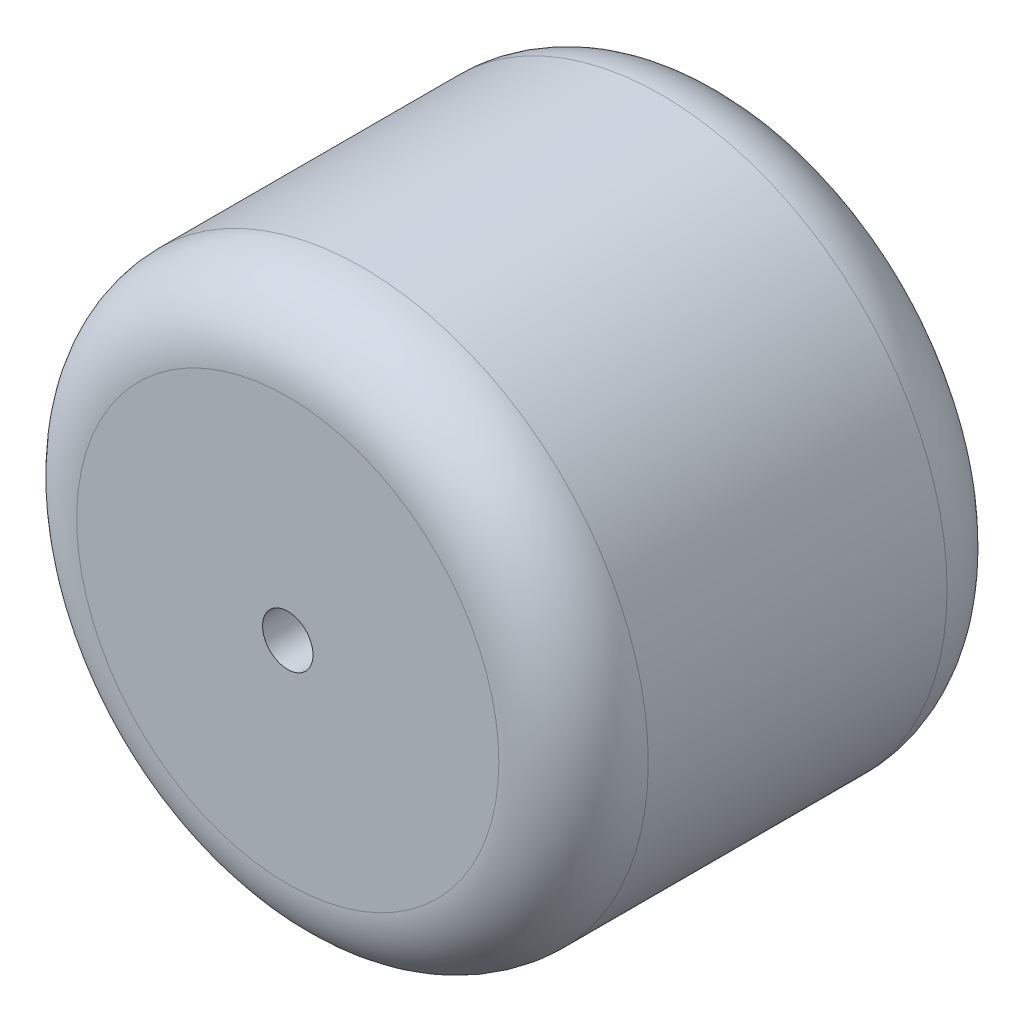
ISO-10303-21;
HEADER;
FILE_DESCRIPTION(('STEP AP214'),'2;1');
FILE_NAME('part.step','',(''),(''),'','','');
FILE_SCHEMA(('AUTOMOTIVE_DESIGN { 1 0 10303 214 1 1 1 1 }'));
ENDSEC;
DATA;
#1=APPLICATION_CONTEXT('core data for automotive mechanical design processes');
#2=APPLICATION_PROTOCOL_DEFINITION('international standard','automotive_design',2000,#1);
#3=PRODUCT_CONTEXT('',#1,'mechanical');
#4=PRODUCT('Part','Part','',(#3));
#5=PRODUCT_RELATED_PRODUCT_CATEGORY('part','',(#4));
#6=PRODUCT_DEFINITION_FORMATION('','',#4);
#7=PRODUCT_DEFINITION_CONTEXT('part definition',#1,'design');
#8=PRODUCT_DEFINITION('design','',#6,#7);
#9=PRODUCT_DEFINITION_SHAPE('','',#8);
#10=(LENGTH_UNIT() NAMED_UNIT(*) SI_UNIT(.MILLI.,.METRE.));
#11=(NAMED_UNIT(*) PLANE_ANGLE_UNIT() SI_UNIT($,.RADIAN.));
#12=(NAMED_UNIT(*) SI_UNIT($,.STERADIAN.) SOLID_ANGLE_UNIT());
#13=UNCERTAINTY_MEASURE_WITH_UNIT(LENGTH_MEASURE(1.E-05),#10,'distance_accuracy_value','');
#14=(GEOMETRIC_REPRESENTATION_CONTEXT(3) GLOBAL_UNCERTAINTY_ASSIGNED_CONTEXT((#13)) GLOBAL_UNIT_ASSIGNED_CONTEXT((#10,
#11,#12)) REPRESENTATION_CONTEXT('',''));
#15=CARTESIAN_POINT('',(0.,0.,0.));
#16=DIRECTION('',(0.,0.,1.));
#17=DIRECTION('',(1.,0.,0.));
#18=AXIS2_PLACEMENT_3D('',#15,#16,#17);
#19=CARTESIAN_POINT('',(0.,0.,12.));
#20=DIRECTION('',(0.,0.,1.));
#21=DIRECTION('',(1.,0.,0.));
#22=AXIS2_PLACEMENT_3D('',#19,#20,#21);
#23=PLANE('',#22);
#24=CARTESIAN_POINT('',(0.,0.,12.));
#25=DIRECTION('',(0.,0.,1.));
#26=DIRECTION('',(1.,0.,0.));
#27=AXIS2_PLACEMENT_3D('',#24,#25,#26);
#28=CIRCLE('',#27,5.65);
#29=CARTESIAN_POINT('',(5.65,0.,12.));
#30=VERTEX_POINT('',#29);
#31=EDGE_CURVE('E54',#30,#30,#28,.T.);
#32=ORIENTED_EDGE('',*,*,#31,.T.);
#33=EDGE_LOOP('',(#32));
#34=FACE_BOUND('',#33,.T.);
#35=CARTESIAN_POINT('',(0.,0.,12.));
#36=DIRECTION('',(0.,0.,1.));
#37=DIRECTION('',(1.,0.,0.));
#38=AXIS2_PLACEMENT_3D('',#35,#36,#37);
#39=CIRCLE('',#38,0.675);
#40=CARTESIAN_POINT('',(0.675,0.,12.));
#41=VERTEX_POINT('',#40);
#42=EDGE_CURVE('E59',#41,#41,#39,.T.);
#43=ORIENTED_EDGE('',*,*,#42,.F.);
#44=EDGE_LOOP('',(#43));
#45=FACE_BOUND('',#44,.T.);
#46=ADVANCED_FACE('F39',(#34,#45),#23,.T.);
#47=CARTESIAN_POINT('',(0.,0.,0.));
#48=DIRECTION('',(0.,0.,1.));
#49=DIRECTION('',(1.,0.,0.));
#50=AXIS2_PLACEMENT_3D('',#47,#48,#49);
#51=PLANE('',#50);
#52=CARTESIAN_POINT('',(0.,0.,0.));
#53=DIRECTION('',(0.,0.,1.));
#54=DIRECTION('',(1.,0.,0.));
#55=AXIS2_PLACEMENT_3D('',#52,#53,#54);
#56=CIRCLE('',#55,5.65);
#57=CARTESIAN_POINT('',(5.65,0.,0.));
#58=VERTEX_POINT('',#57);
#59=EDGE_CURVE('E10',#58,#58,#56,.F.);
#60=ORIENTED_EDGE('',*,*,#59,.T.);
#61=EDGE_LOOP('',(#60));
#62=FACE_BOUND('',#61,.T.);
#63=CARTESIAN_POINT('',(0.,0.,0.));
#64=DIRECTION('',(0.,0.,1.));
#65=DIRECTION('',(1.,0.,0.));
#66=AXIS2_PLACEMENT_3D('',#63,#64,#65);
#67=CIRCLE('',#66,0.675);
#68=CARTESIAN_POINT('',(0.675,0.,0.));
#69=VERTEX_POINT('',#68);
#70=EDGE_CURVE('E60',#69,#69,#67,.T.);
#71=ORIENTED_EDGE('',*,*,#70,.T.);
#72=EDGE_LOOP('',(#71));
#73=FACE_BOUND('',#72,.T.);
#74=ADVANCED_FACE('F70',(#62,#73),#51,.F.);
#75=CARTESIAN_POINT('',(0.,0.,12.));
#76=DIRECTION('',(0.,0.,-1.));
#77=DIRECTION('',(-1.,0.,0.));
#78=AXIS2_PLACEMENT_3D('',#75,#76,#77);
#79=CYLINDRICAL_SURFACE('',#78,7.65);
#80=CARTESIAN_POINT('',(0.,0.,10.));
#81=DIRECTION('',(0.,0.,1.));
#82=DIRECTION('',(1.,0.,0.));
#83=AXIS2_PLACEMENT_3D('',#80,#81,#82);
#84=CIRCLE('',#83,7.65);
#85=CARTESIAN_POINT('',(7.65,0.,10.));
#86=VERTEX_POINT('',#85);
#87=EDGE_CURVE('E46',#86,#86,#84,.F.);
#88=ORIENTED_EDGE('',*,*,#87,.T.);
#89=EDGE_LOOP('',(#88));
#90=FACE_BOUND('',#89,.T.);
#91=CARTESIAN_POINT('',(0.,0.,2.));
#92=DIRECTION('',(0.,0.,1.));
#93=DIRECTION('',(1.,0.,0.));
#94=AXIS2_PLACEMENT_3D('',#91,#92,#93);
#95=CIRCLE('',#94,7.65);
#96=CARTESIAN_POINT('',(7.65,0.,2.));
#97=VERTEX_POINT('',#96);
#98=EDGE_CURVE('E50',#97,#97,#95,.T.);
#99=ORIENTED_EDGE('',*,*,#98,.T.);
#100=EDGE_LOOP('',(#99));
#101=FACE_BOUND('',#100,.T.);
#102=ADVANCED_FACE('F77',(#90,#101),#79,.T.);
#103=CARTESIAN_POINT('',(0.,0.,12.));
#104=DIRECTION('',(0.,0.,-1.));
#105=DIRECTION('',(-1.,0.,0.));
#106=AXIS2_PLACEMENT_3D('',#103,#104,#105);
#107=CYLINDRICAL_SURFACE('',#106,0.675);
#108=ORIENTED_EDGE('',*,*,#42,.T.);
#109=EDGE_LOOP('',(#108));
#110=FACE_BOUND('',#109,.T.);
#111=ORIENTED_EDGE('',*,*,#70,.F.);
#112=EDGE_LOOP('',(#111));
#113=FACE_BOUND('',#112,.T.);
#114=ADVANCED_FACE('F66',(#110,#113),#107,.F.);
#115=CARTESIAN_POINT('',(0.,0.,10.));
#116=DIRECTION('',(0.,0.,1.));
#117=DIRECTION('',(1.,0.,0.));
#118=AXIS2_PLACEMENT_3D('',#115,#116,#117);
#119=TOROIDAL_SURFACE('',#118,5.65,2.);
#120=ORIENTED_EDGE('',*,*,#87,.F.);
#121=EDGE_LOOP('',(#120));
#122=FACE_BOUND('',#121,.T.);
#123=ORIENTED_EDGE('',*,*,#31,.F.);
#124=EDGE_LOOP('',(#123));
#125=FACE_BOUND('',#124,.T.);
#126=ADVANCED_FACE('F82',(#122,#125),#119,.T.);
#127=CARTESIAN_POINT('',(0.,0.,2.));
#128=DIRECTION('',(0.,0.,1.));
#129=DIRECTION('',(1.,0.,0.));
#130=AXIS2_PLACEMENT_3D('',#127,#128,#129);
#131=TOROIDAL_SURFACE('',#130,5.65,2.);
#132=ORIENTED_EDGE('',*,*,#59,.F.);
#133=EDGE_LOOP('',(#132));
#134=FACE_BOUND('',#133,.T.);
#135=ORIENTED_EDGE('',*,*,#98,.F.);
#136=EDGE_LOOP('',(#135));
#137=FACE_BOUND('',#136,.T.);
#138=ADVANCED_FACE('F41',(#134,#137),#131,.T.);
#139=CLOSED_SHELL('',(#46,#74,#102,#114,#126,#138));
#140=MANIFOLD_SOLID_BREP('B2',#139);
#141=ADVANCED_BREP_SHAPE_REPRESENTATION('',(#18,#140),#14);
#142=SHAPE_DEFINITION_REPRESENTATION(#9,#141);
ENDSEC;
END-ISO-10303-21;
